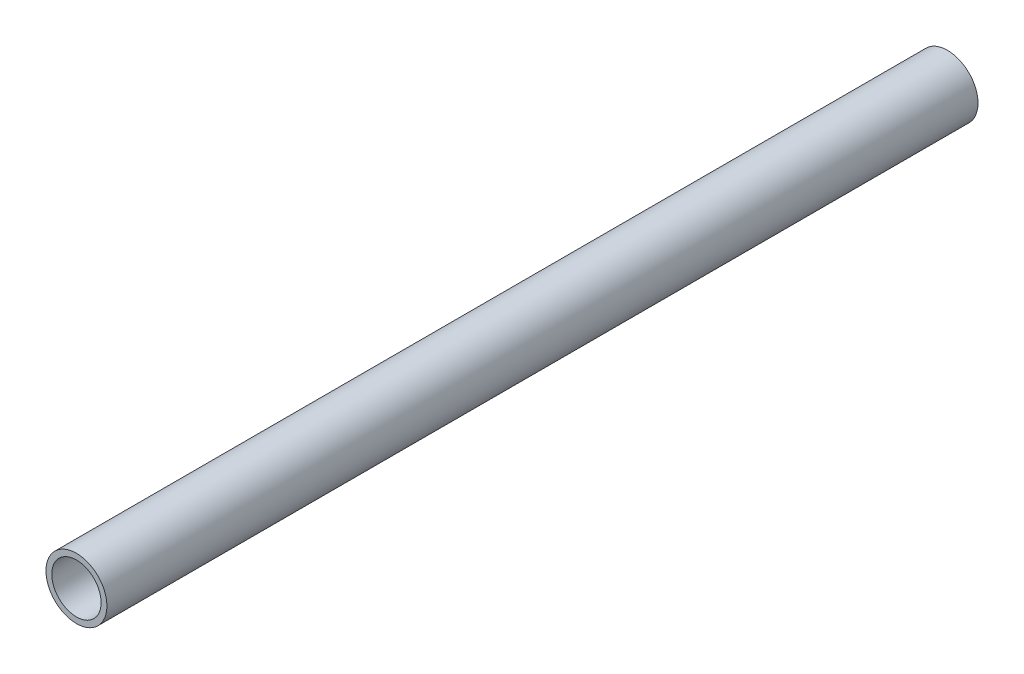
ISO-10303-21;
HEADER;
FILE_DESCRIPTION(('STEP AP214'),'2;1');
FILE_NAME('part.step','',(''),(''),'','','');
FILE_SCHEMA(('AUTOMOTIVE_DESIGN { 1 0 10303 214 1 1 1 1 }'));
ENDSEC;
DATA;
#1=APPLICATION_CONTEXT('core data for automotive mechanical design processes');
#2=APPLICATION_PROTOCOL_DEFINITION('international standard','automotive_design',2000,#1);
#3=PRODUCT_CONTEXT('',#1,'mechanical');
#4=PRODUCT('Part','Part','',(#3));
#5=PRODUCT_RELATED_PRODUCT_CATEGORY('part','',(#4));
#6=PRODUCT_DEFINITION_FORMATION('','',#4);
#7=PRODUCT_DEFINITION_CONTEXT('part definition',#1,'design');
#8=PRODUCT_DEFINITION('design','',#6,#7);
#9=PRODUCT_DEFINITION_SHAPE('','',#8);
#10=(LENGTH_UNIT() NAMED_UNIT(*) SI_UNIT(.MILLI.,.METRE.));
#11=(NAMED_UNIT(*) PLANE_ANGLE_UNIT() SI_UNIT($,.RADIAN.));
#12=(NAMED_UNIT(*) SI_UNIT($,.STERADIAN.) SOLID_ANGLE_UNIT());
#13=UNCERTAINTY_MEASURE_WITH_UNIT(LENGTH_MEASURE(1.E-05),#10,'distance_accuracy_value','');
#14=(GEOMETRIC_REPRESENTATION_CONTEXT(3) GLOBAL_UNCERTAINTY_ASSIGNED_CONTEXT((#13)) GLOBAL_UNIT_ASSIGNED_CONTEXT((#10,
#11,#12)) REPRESENTATION_CONTEXT('',''));
#15=CARTESIAN_POINT('',(0.,0.,0.));
#16=DIRECTION('',(0.,0.,1.));
#17=DIRECTION('',(1.,0.,0.));
#18=AXIS2_PLACEMENT_3D('',#15,#16,#17);
#19=CARTESIAN_POINT('',(0.,0.,228.6));
#20=DIRECTION('',(0.,0.,1.));
#21=DIRECTION('',(1.,0.,0.));
#22=AXIS2_PLACEMENT_3D('',#19,#20,#21);
#23=PLANE('',#22);
#24=CARTESIAN_POINT('',(0.,0.,228.6));
#25=DIRECTION('',(0.,0.,1.));
#26=DIRECTION('',(1.,0.,0.));
#27=AXIS2_PLACEMENT_3D('',#24,#25,#26);
#28=CIRCLE('',#27,8.001);
#29=CARTESIAN_POINT('',(8.001,0.,228.6));
#30=VERTEX_POINT('',#29);
#31=EDGE_CURVE('E10',#30,#30,#28,.T.);
#32=ORIENTED_EDGE('',*,*,#31,.T.);
#33=EDGE_LOOP('',(#32));
#34=FACE_BOUND('',#33,.T.);
#35=CARTESIAN_POINT('',(0.,0.,228.6));
#36=DIRECTION('',(0.,0.,1.));
#37=DIRECTION('',(1.,0.,0.));
#38=AXIS2_PLACEMENT_3D('',#35,#36,#37);
#39=CIRCLE('',#38,6.477);
#40=CARTESIAN_POINT('',(6.477,0.,228.6));
#41=VERTEX_POINT('',#40);
#42=EDGE_CURVE('E48',#41,#41,#39,.T.);
#43=ORIENTED_EDGE('',*,*,#42,.F.);
#44=EDGE_LOOP('',(#43));
#45=FACE_BOUND('',#44,.T.);
#46=ADVANCED_FACE('F35',(#34,#45),#23,.T.);
#47=CARTESIAN_POINT('',(0.,0.,0.));
#48=DIRECTION('',(0.,0.,1.));
#49=DIRECTION('',(1.,0.,0.));
#50=AXIS2_PLACEMENT_3D('',#47,#48,#49);
#51=PLANE('',#50);
#52=CARTESIAN_POINT('',(0.,0.,0.));
#53=DIRECTION('',(0.,0.,1.));
#54=DIRECTION('',(1.,0.,0.));
#55=AXIS2_PLACEMENT_3D('',#52,#53,#54);
#56=CIRCLE('',#55,8.001);
#57=CARTESIAN_POINT('',(8.001,0.,0.));
#58=VERTEX_POINT('',#57);
#59=EDGE_CURVE('E39',#58,#58,#56,.T.);
#60=ORIENTED_EDGE('',*,*,#59,.F.);
#61=EDGE_LOOP('',(#60));
#62=FACE_BOUND('',#61,.T.);
#63=CARTESIAN_POINT('',(0.,0.,0.));
#64=DIRECTION('',(0.,0.,1.));
#65=DIRECTION('',(1.,0.,0.));
#66=AXIS2_PLACEMENT_3D('',#63,#64,#65);
#67=CIRCLE('',#66,6.477);
#68=CARTESIAN_POINT('',(6.477,0.,0.));
#69=VERTEX_POINT('',#68);
#70=EDGE_CURVE('E50',#69,#69,#67,.T.);
#71=ORIENTED_EDGE('',*,*,#70,.T.);
#72=EDGE_LOOP('',(#71));
#73=FACE_BOUND('',#72,.T.);
#74=ADVANCED_FACE('F62',(#62,#73),#51,.F.);
#75=CARTESIAN_POINT('',(0.,0.,228.6));
#76=DIRECTION('',(0.,0.,-1.));
#77=DIRECTION('',(-1.,0.,0.));
#78=AXIS2_PLACEMENT_3D('',#75,#76,#77);
#79=CYLINDRICAL_SURFACE('',#78,8.001);
#80=ORIENTED_EDGE('',*,*,#31,.F.);
#81=EDGE_LOOP('',(#80));
#82=FACE_BOUND('',#81,.T.);
#83=ORIENTED_EDGE('',*,*,#59,.T.);
#84=EDGE_LOOP('',(#83));
#85=FACE_BOUND('',#84,.T.);
#86=ADVANCED_FACE('F37',(#82,#85),#79,.T.);
#87=CARTESIAN_POINT('',(0.,0.,228.6));
#88=DIRECTION('',(0.,0.,-1.));
#89=DIRECTION('',(-1.,0.,0.));
#90=AXIS2_PLACEMENT_3D('',#87,#88,#89);
#91=CYLINDRICAL_SURFACE('',#90,6.477);
#92=ORIENTED_EDGE('',*,*,#42,.T.);
#93=EDGE_LOOP('',(#92));
#94=FACE_BOUND('',#93,.T.);
#95=ORIENTED_EDGE('',*,*,#70,.F.);
#96=EDGE_LOOP('',(#95));
#97=FACE_BOUND('',#96,.T.);
#98=ADVANCED_FACE('F58',(#94,#97),#91,.F.);
#99=CLOSED_SHELL('',(#46,#74,#86,#98));
#100=MANIFOLD_SOLID_BREP('B2',#99);
#101=ADVANCED_BREP_SHAPE_REPRESENTATION('',(#18,#100),#14);
#102=SHAPE_DEFINITION_REPRESENTATION(#9,#101);
ENDSEC;
END-ISO-10303-21;
